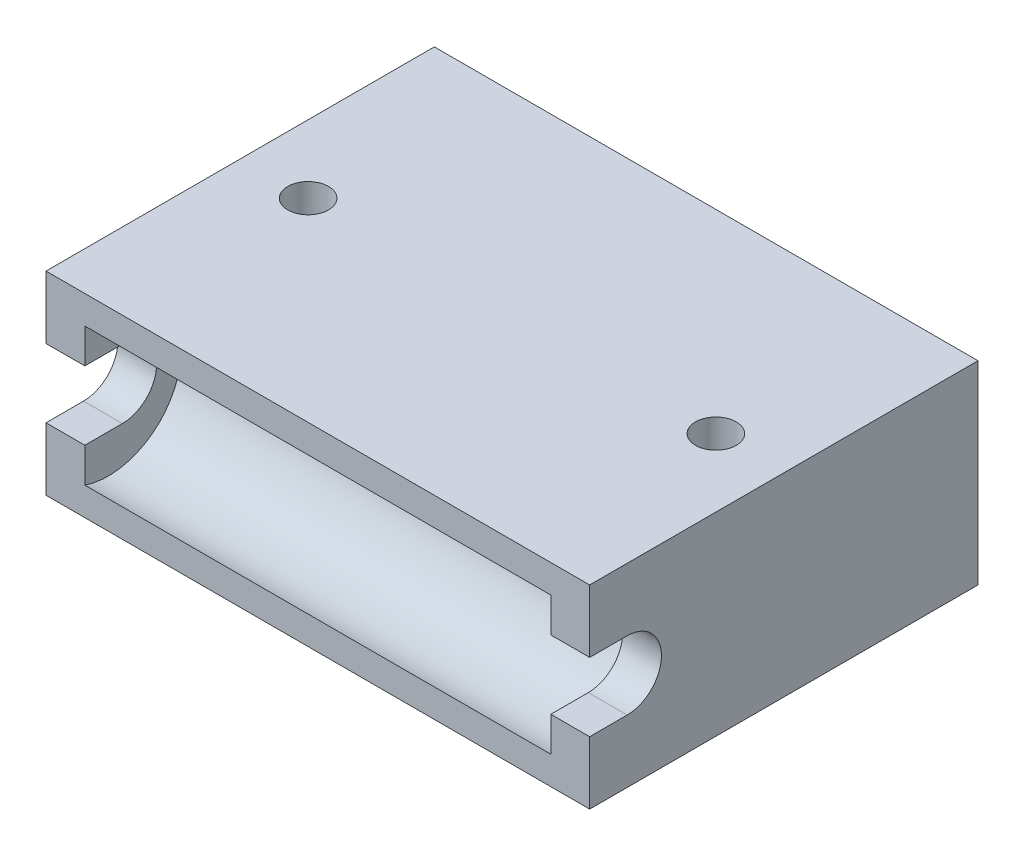
ISO-10303-21;
HEADER;
FILE_DESCRIPTION(('STEP AP214'),'2;1');
FILE_NAME('part.step','',(''),(''),'','','');
FILE_SCHEMA(('AUTOMOTIVE_DESIGN { 1 0 10303 214 1 1 1 1 }'));
ENDSEC;
DATA;
#1=APPLICATION_CONTEXT('core data for automotive mechanical design processes');
#2=APPLICATION_PROTOCOL_DEFINITION('international standard','automotive_design',2000,#1);
#3=PRODUCT_CONTEXT('',#1,'mechanical');
#4=PRODUCT('Part','Part','',(#3));
#5=PRODUCT_RELATED_PRODUCT_CATEGORY('part','',(#4));
#6=PRODUCT_DEFINITION_FORMATION('','',#4);
#7=PRODUCT_DEFINITION_CONTEXT('part definition',#1,'design');
#8=PRODUCT_DEFINITION('design','',#6,#7);
#9=PRODUCT_DEFINITION_SHAPE('','',#8);
#10=(LENGTH_UNIT() NAMED_UNIT(*) SI_UNIT(.MILLI.,.METRE.));
#11=(NAMED_UNIT(*) PLANE_ANGLE_UNIT() SI_UNIT($,.RADIAN.));
#12=(NAMED_UNIT(*) SI_UNIT($,.STERADIAN.) SOLID_ANGLE_UNIT());
#13=UNCERTAINTY_MEASURE_WITH_UNIT(LENGTH_MEASURE(1.E-05),#10,'distance_accuracy_value','');
#14=(GEOMETRIC_REPRESENTATION_CONTEXT(3) GLOBAL_UNCERTAINTY_ASSIGNED_CONTEXT((#13)) GLOBAL_UNIT_ASSIGNED_CONTEXT((#10,
#11,#12)) REPRESENTATION_CONTEXT('',''));
#15=CARTESIAN_POINT('',(0.,0.,0.));
#16=DIRECTION('',(0.,0.,1.));
#17=DIRECTION('',(1.,0.,0.));
#18=AXIS2_PLACEMENT_3D('',#15,#16,#17);
#19=CARTESIAN_POINT('',(16.7824266476569,0.,21.5533474487606));
#20=DIRECTION('',(0.,1.,0.));
#21=DIRECTION('',(0.,0.,1.));
#22=AXIS2_PLACEMENT_3D('',#19,#20,#21);
#23=CYLINDRICAL_SURFACE('',#22,2.1);
#24=CARTESIAN_POINT('',(16.7824266476569,20.,21.5533474487606));
#25=DIRECTION('',(0.,1.,0.));
#26=DIRECTION('',(0.,0.,1.));
#27=AXIS2_PLACEMENT_3D('',#24,#25,#26);
#28=CIRCLE('',#27,2.1);
#29=CARTESIAN_POINT('',(16.7824266476569,20.,23.6533474487606));
#30=VERTEX_POINT('',#29);
#31=EDGE_CURVE('E311',#30,#30,#28,.T.);
#32=ORIENTED_EDGE('',*,*,#31,.T.);
#33=EDGE_LOOP('',(#32));
#34=FACE_BOUND('',#33,.T.);
#35=CARTESIAN_POINT('',(16.7824266476569,10.,21.5533474487606));
#36=DIRECTION('',(0.,-1.,0.));
#37=DIRECTION('',(0.,0.,-1.));
#38=AXIS2_PLACEMENT_3D('',#35,#36,#37);
#39=CIRCLE('',#38,2.1);
#40=CARTESIAN_POINT('',(16.7824266476569,10.,19.4533474487606));
#41=VERTEX_POINT('',#40);
#42=EDGE_CURVE('E39',#41,#41,#39,.F.);
#43=ORIENTED_EDGE('',*,*,#42,.F.);
#44=EDGE_LOOP('',(#43));
#45=FACE_BOUND('',#44,.T.);
#46=ADVANCED_FACE('F35',(#34,#45),#23,.F.);
#47=CARTESIAN_POINT('',(-25.2175733523431,0.,21.5533474487606));
#48=DIRECTION('',(0.,1.,0.));
#49=DIRECTION('',(0.,0.,1.));
#50=AXIS2_PLACEMENT_3D('',#47,#48,#49);
#51=CYLINDRICAL_SURFACE('',#50,2.1);
#52=CARTESIAN_POINT('',(-25.2175733523431,20.,21.5533474487606));
#53=DIRECTION('',(0.,1.,0.));
#54=DIRECTION('',(0.,0.,1.));
#55=AXIS2_PLACEMENT_3D('',#52,#53,#54);
#56=CIRCLE('',#55,2.1);
#57=CARTESIAN_POINT('',(-25.2175733523431,20.,23.6533474487606));
#58=VERTEX_POINT('',#57);
#59=EDGE_CURVE('E314',#58,#58,#56,.T.);
#60=ORIENTED_EDGE('',*,*,#59,.T.);
#61=EDGE_LOOP('',(#60));
#62=FACE_BOUND('',#61,.T.);
#63=CARTESIAN_POINT('',(-25.2175733523431,10.,21.5533474487606));
#64=DIRECTION('',(0.,-1.,0.));
#65=DIRECTION('',(0.,0.,-1.));
#66=AXIS2_PLACEMENT_3D('',#63,#64,#65);
#67=CIRCLE('',#66,2.1);
#68=CARTESIAN_POINT('',(-25.2175733523431,10.,19.4533474487606));
#69=VERTEX_POINT('',#68);
#70=EDGE_CURVE('E301',#69,#69,#67,.F.);
#71=ORIENTED_EDGE('',*,*,#70,.F.);
#72=EDGE_LOOP('',(#71));
#73=FACE_BOUND('',#72,.T.);
#74=ADVANCED_FACE('F429',(#62,#73),#51,.F.);
#75=CARTESIAN_POINT('',(-32.2175733523431,20.,41.5533474487606));
#76=DIRECTION('',(0.,0.,-1.));
#77=DIRECTION('',(-1.,0.,0.));
#78=AXIS2_PLACEMENT_3D('',#75,#76,#77);
#79=PLANE('',#78);
#80=DIRECTION('',(1.,0.,0.));
#81=VECTOR('',#80,1.);
#82=CARTESIAN_POINT('',(-32.2175733523431,6.465,41.5533474487606));
#83=LINE('',#82,#81);
#84=CARTESIAN_POINT('',(-32.2175733523431,6.465,41.5533474487606));
#85=VERTEX_POINT('',#84);
#86=CARTESIAN_POINT('',(-28.2175733523431,6.465,41.5533474487606));
#87=VERTEX_POINT('',#86);
#88=EDGE_CURVE('E343',#85,#87,#83,.T.);
#89=ORIENTED_EDGE('',*,*,#88,.F.);
#90=DIRECTION('',(0.,-1.,0.));
#91=VECTOR('',#90,1.);
#92=CARTESIAN_POINT('',(-32.2175733523431,20.,41.5533474487606));
#93=LINE('',#92,#91);
#94=CARTESIAN_POINT('',(-32.2175733523431,0.,41.5533474487606));
#95=VERTEX_POINT('',#94);
#96=EDGE_CURVE('E402',#85,#95,#93,.T.);
#97=ORIENTED_EDGE('',*,*,#96,.T.);
#98=DIRECTION('',(1.,0.,0.));
#99=VECTOR('',#98,1.);
#100=CARTESIAN_POINT('',(-32.2175733523431,0.,41.5533474487606));
#101=LINE('',#100,#99);
#102=CARTESIAN_POINT('',(23.7824266476569,0.,41.5533474487606));
#103=VERTEX_POINT('',#102);
#104=EDGE_CURVE('E391',#95,#103,#101,.T.);
#105=ORIENTED_EDGE('',*,*,#104,.T.);
#106=DIRECTION('',(0.,-1.,0.));
#107=VECTOR('',#106,1.);
#108=CARTESIAN_POINT('',(23.7824266476569,20.,41.5533474487606));
#109=LINE('',#108,#107);
#110=CARTESIAN_POINT('',(23.7824266476569,6.465,41.5533474487606));
#111=VERTEX_POINT('',#110);
#112=EDGE_CURVE('E406',#111,#103,#109,.T.);
#113=ORIENTED_EDGE('',*,*,#112,.F.);
#114=CARTESIAN_POINT('',(19.7824266476569,6.465,41.5533474487606));
#115=VERTEX_POINT('',#114);
#116=EDGE_CURVE('E342',#115,#111,#83,.T.);
#117=ORIENTED_EDGE('',*,*,#116,.F.);
#118=DIRECTION('',(0.,1.,0.));
#119=VECTOR('',#118,1.);
#120=CARTESIAN_POINT('',(19.7824266476569,20.,41.5533474487606));
#121=LINE('',#120,#119);
#122=CARTESIAN_POINT('',(19.7824266476569,2.90034244287919,41.5533474487606));
#123=VERTEX_POINT('',#122);
#124=EDGE_CURVE('E418',#123,#115,#121,.T.);
#125=ORIENTED_EDGE('',*,*,#124,.F.);
#126=DIRECTION('',(-1.,0.,0.));
#127=VECTOR('',#126,1.);
#128=CARTESIAN_POINT('',(19.7824266476569,2.90034244287919,41.5533474487606));
#129=LINE('',#128,#127);
#130=CARTESIAN_POINT('',(-28.2175733523431,2.90034244287919,41.5533474487606));
#131=VERTEX_POINT('',#130);
#132=EDGE_CURVE('E414',#123,#131,#129,.T.);
#133=ORIENTED_EDGE('',*,*,#132,.T.);
#134=DIRECTION('',(0.,1.,0.));
#135=VECTOR('',#134,1.);
#136=CARTESIAN_POINT('',(-28.2175733523431,20.,41.5533474487606));
#137=LINE('',#136,#135);
#138=EDGE_CURVE('E408',#131,#87,#137,.T.);
#139=ORIENTED_EDGE('',*,*,#138,.T.);
#140=EDGE_LOOP('',(#89,#97,#105,#113,#117,#125,#133,#139));
#141=FACE_BOUND('',#140,.T.);
#142=ADVANCED_FACE('F431',(#141),#79,.F.);
#143=DIRECTION('',(1.,0.,0.));
#144=VECTOR('',#143,1.);
#145=CARTESIAN_POINT('',(-32.2175733523431,13.535,41.5533474487606));
#146=LINE('',#145,#144);
#147=CARTESIAN_POINT('',(19.7824266476569,13.535,41.5533474487606));
#148=VERTEX_POINT('',#147);
#149=CARTESIAN_POINT('',(23.7824266476569,13.535,41.5533474487606));
#150=VERTEX_POINT('',#149);
#151=EDGE_CURVE('E338',#148,#150,#146,.T.);
#152=ORIENTED_EDGE('',*,*,#151,.T.);
#153=CARTESIAN_POINT('',(23.7824266476569,20.,41.5533474487606));
#154=VERTEX_POINT('',#153);
#155=EDGE_CURVE('E403',#154,#150,#109,.T.);
#156=ORIENTED_EDGE('',*,*,#155,.F.);
#157=DIRECTION('',(1.,0.,0.));
#158=VECTOR('',#157,1.);
#159=CARTESIAN_POINT('',(-32.2175733523431,20.,41.5533474487606));
#160=LINE('',#159,#158);
#161=CARTESIAN_POINT('',(-32.2175733523431,20.,41.5533474487606));
#162=VERTEX_POINT('',#161);
#163=EDGE_CURVE('E381',#162,#154,#160,.T.);
#164=ORIENTED_EDGE('',*,*,#163,.F.);
#165=CARTESIAN_POINT('',(-32.2175733523431,13.535,41.5533474487606));
#166=VERTEX_POINT('',#165);
#167=EDGE_CURVE('E399',#162,#166,#93,.T.);
#168=ORIENTED_EDGE('',*,*,#167,.T.);
#169=CARTESIAN_POINT('',(-28.2175733523431,13.535,41.5533474487606));
#170=VERTEX_POINT('',#169);
#171=EDGE_CURVE('E339',#166,#170,#146,.T.);
#172=ORIENTED_EDGE('',*,*,#171,.T.);
#173=CARTESIAN_POINT('',(-28.2175733523431,17.0996575571208,41.5533474487606));
#174=VERTEX_POINT('',#173);
#175=EDGE_CURVE('E398',#170,#174,#137,.T.);
#176=ORIENTED_EDGE('',*,*,#175,.T.);
#177=DIRECTION('',(-1.,0.,0.));
#178=VECTOR('',#177,1.);
#179=CARTESIAN_POINT('',(19.7824266476569,17.0996575571208,41.5533474487606));
#180=LINE('',#179,#178);
#181=CARTESIAN_POINT('',(19.7824266476569,17.0996575571208,41.5533474487606));
#182=VERTEX_POINT('',#181);
#183=EDGE_CURVE('E411',#174,#182,#180,.F.);
#184=ORIENTED_EDGE('',*,*,#183,.T.);
#185=EDGE_CURVE('E417',#148,#182,#121,.T.);
#186=ORIENTED_EDGE('',*,*,#185,.F.);
#187=EDGE_LOOP('',(#152,#156,#164,#168,#172,#176,#184,#186));
#188=FACE_BOUND('',#187,.T.);
#189=ADVANCED_FACE('F439',(#188),#79,.F.);
#190=CARTESIAN_POINT('',(-32.2175733523431,20.,1.55334744876063));
#191=DIRECTION('',(1.,0.,0.));
#192=DIRECTION('',(0.,0.,-1.));
#193=AXIS2_PLACEMENT_3D('',#190,#191,#192);
#194=PLANE('',#193);
#195=DIRECTION('',(0.,0.,1.));
#196=VECTOR('',#195,1.);
#197=CARTESIAN_POINT('',(-32.2175733523431,6.465,37.6937344646251));
#198=LINE('',#197,#196);
#199=CARTESIAN_POINT('',(-32.2175733523431,6.465,37.6937344646251));
#200=VERTEX_POINT('',#199);
#201=EDGE_CURVE('E331',#200,#85,#198,.T.);
#202=ORIENTED_EDGE('',*,*,#201,.F.);
#203=CARTESIAN_POINT('',(-32.2175733523431,10.,37.6937344646251));
#204=DIRECTION('',(-1.,0.,0.));
#205=DIRECTION('',(0.,0.,1.));
#206=AXIS2_PLACEMENT_3D('',#203,#204,#205);
#207=CIRCLE('',#206,3.53499999999999);
#208=CARTESIAN_POINT('',(-32.2175733523431,13.535,37.6937344646251));
#209=VERTEX_POINT('',#208);
#210=EDGE_CURVE('E327',#209,#200,#207,.T.);
#211=ORIENTED_EDGE('',*,*,#210,.F.);
#212=DIRECTION('',(0.,0.,-1.));
#213=VECTOR('',#212,1.);
#214=CARTESIAN_POINT('',(-32.2175733523431,13.535,37.6937344646251));
#215=LINE('',#214,#213);
#216=EDGE_CURVE('E333',#166,#209,#215,.T.);
#217=ORIENTED_EDGE('',*,*,#216,.F.);
#218=ORIENTED_EDGE('',*,*,#167,.F.);
#219=DIRECTION('',(0.,0.,1.));
#220=VECTOR('',#219,1.);
#221=CARTESIAN_POINT('',(-32.2175733523431,20.,1.55334744876063));
#222=LINE('',#221,#220);
#223=CARTESIAN_POINT('',(-32.2175733523431,20.,1.55334744876063));
#224=VERTEX_POINT('',#223);
#225=EDGE_CURVE('E383',#224,#162,#222,.T.);
#226=ORIENTED_EDGE('',*,*,#225,.F.);
#227=DIRECTION('',(0.,-1.,0.));
#228=VECTOR('',#227,1.);
#229=CARTESIAN_POINT('',(-32.2175733523431,20.,1.55334744876063));
#230=LINE('',#229,#228);
#231=CARTESIAN_POINT('',(-32.2175733523431,0.,1.55334744876063));
#232=VERTEX_POINT('',#231);
#233=EDGE_CURVE('E396',#224,#232,#230,.T.);
#234=ORIENTED_EDGE('',*,*,#233,.T.);
#235=DIRECTION('',(0.,0.,1.));
#236=VECTOR('',#235,1.);
#237=CARTESIAN_POINT('',(-32.2175733523431,0.,1.55334744876063));
#238=LINE('',#237,#236);
#239=EDGE_CURVE('E378',#232,#95,#238,.T.);
#240=ORIENTED_EDGE('',*,*,#239,.T.);
#241=ORIENTED_EDGE('',*,*,#96,.F.);
#242=EDGE_LOOP('',(#202,#211,#217,#218,#226,#234,#240,#241));
#243=FACE_BOUND('',#242,.T.);
#244=ADVANCED_FACE('F497',(#243),#194,.F.);
#245=CARTESIAN_POINT('',(23.7824266476569,20.,1.55334744876063));
#246=DIRECTION('',(1.,0.,0.));
#247=DIRECTION('',(0.,0.,-1.));
#248=AXIS2_PLACEMENT_3D('',#245,#246,#247);
#249=PLANE('',#248);
#250=CARTESIAN_POINT('',(23.7824266476569,10.,37.6937344646251));
#251=DIRECTION('',(1.,0.,0.));
#252=DIRECTION('',(0.,0.,-1.));
#253=AXIS2_PLACEMENT_3D('',#250,#251,#252);
#254=CIRCLE('',#253,3.53499999999999);
#255=CARTESIAN_POINT('',(23.7824266476569,13.535,37.6937344646251));
#256=VERTEX_POINT('',#255);
#257=CARTESIAN_POINT('',(23.7824266476569,6.465,37.6937344646251));
#258=VERTEX_POINT('',#257);
#259=EDGE_CURVE('E364',#256,#258,#254,.F.);
#260=ORIENTED_EDGE('',*,*,#259,.T.);
#261=DIRECTION('',(0.,0.,1.));
#262=VECTOR('',#261,1.);
#263=CARTESIAN_POINT('',(23.7824266476569,6.465,1.55334744876063));
#264=LINE('',#263,#262);
#265=EDGE_CURVE('E358',#258,#111,#264,.T.);
#266=ORIENTED_EDGE('',*,*,#265,.T.);
#267=ORIENTED_EDGE('',*,*,#112,.T.);
#268=DIRECTION('',(0.,0.,1.));
#269=VECTOR('',#268,1.);
#270=CARTESIAN_POINT('',(23.7824266476569,0.,1.55334744876063));
#271=LINE('',#270,#269);
#272=CARTESIAN_POINT('',(23.7824266476569,0.,1.55334744876063));
#273=VERTEX_POINT('',#272);
#274=EDGE_CURVE('E388',#273,#103,#271,.T.);
#275=ORIENTED_EDGE('',*,*,#274,.F.);
#276=DIRECTION('',(0.,-1.,0.));
#277=VECTOR('',#276,1.);
#278=CARTESIAN_POINT('',(23.7824266476569,20.,1.55334744876063));
#279=LINE('',#278,#277);
#280=CARTESIAN_POINT('',(23.7824266476569,20.,1.55334744876063));
#281=VERTEX_POINT('',#280);
#282=EDGE_CURVE('E385',#281,#273,#279,.T.);
#283=ORIENTED_EDGE('',*,*,#282,.F.);
#284=DIRECTION('',(0.,0.,1.));
#285=VECTOR('',#284,1.);
#286=CARTESIAN_POINT('',(23.7824266476569,20.,1.55334744876063));
#287=LINE('',#286,#285);
#288=EDGE_CURVE('E377',#281,#154,#287,.T.);
#289=ORIENTED_EDGE('',*,*,#288,.T.);
#290=ORIENTED_EDGE('',*,*,#155,.T.);
#291=DIRECTION('',(0.,0.,-1.));
#292=VECTOR('',#291,1.);
#293=CARTESIAN_POINT('',(23.7824266476569,13.535,1.55334744876063));
#294=LINE('',#293,#292);
#295=EDGE_CURVE('E352',#150,#256,#294,.T.);
#296=ORIENTED_EDGE('',*,*,#295,.T.);
#297=EDGE_LOOP('',(#260,#266,#267,#275,#283,#289,#290,#296));
#298=FACE_BOUND('',#297,.T.);
#299=ADVANCED_FACE('F480',(#298),#249,.T.);
#300=CARTESIAN_POINT('',(19.7824266476569,10.,39.1357323901507));
#301=DIRECTION('',(-1.,0.,0.));
#302=DIRECTION('',(0.,0.,1.));
#303=AXIS2_PLACEMENT_3D('',#300,#301,#302);
#304=PLANE('',#303);
#305=ORIENTED_EDGE('',*,*,#124,.T.);
#306=DIRECTION('',(0.,0.,-1.));
#307=VECTOR('',#306,1.);
#308=CARTESIAN_POINT('',(19.7824266476569,6.465,39.1357323901507));
#309=LINE('',#308,#307);
#310=CARTESIAN_POINT('',(19.7824266476569,6.465,37.6937344646251));
#311=VERTEX_POINT('',#310);
#312=EDGE_CURVE('E355',#115,#311,#309,.T.);
#313=ORIENTED_EDGE('',*,*,#312,.T.);
#314=CARTESIAN_POINT('',(19.7824266476569,10.,37.6937344646251));
#315=DIRECTION('',(-1.,0.,0.));
#316=DIRECTION('',(0.,0.,1.));
#317=AXIS2_PLACEMENT_3D('',#314,#315,#316);
#318=CIRCLE('',#317,3.53499999999999);
#319=CARTESIAN_POINT('',(19.7824266476569,13.535,37.6937344646251));
#320=VERTEX_POINT('',#319);
#321=EDGE_CURVE('E361',#311,#320,#318,.F.);
#322=ORIENTED_EDGE('',*,*,#321,.T.);
#323=DIRECTION('',(0.,0.,1.));
#324=VECTOR('',#323,1.);
#325=CARTESIAN_POINT('',(19.7824266476569,13.535,39.1357323901507));
#326=LINE('',#325,#324);
#327=EDGE_CURVE('E349',#320,#148,#326,.T.);
#328=ORIENTED_EDGE('',*,*,#327,.T.);
#329=ORIENTED_EDGE('',*,*,#185,.T.);
#330=CARTESIAN_POINT('',(19.7824266476569,10.,39.1357323901507));
#331=DIRECTION('',(-1.,0.,0.));
#332=DIRECTION('',(0.,0.,1.));
#333=AXIS2_PLACEMENT_3D('',#330,#331,#332);
#334=CIRCLE('',#333,7.5);
#335=EDGE_CURVE('E368',#182,#123,#334,.T.);
#336=ORIENTED_EDGE('',*,*,#335,.T.);
#337=EDGE_LOOP('',(#305,#313,#322,#328,#329,#336));
#338=FACE_BOUND('',#337,.T.);
#339=ADVANCED_FACE('F476',(#338),#304,.T.);
#340=CARTESIAN_POINT('',(-28.2175733523431,10.,39.1357323901507));
#341=DIRECTION('',(-1.,0.,0.));
#342=DIRECTION('',(0.,0.,1.));
#343=AXIS2_PLACEMENT_3D('',#340,#341,#342);
#344=PLANE('',#343);
#345=DIRECTION('',(0.,0.,-1.));
#346=VECTOR('',#345,1.);
#347=CARTESIAN_POINT('',(-28.2175733523431,6.465,39.1357323901507));
#348=LINE('',#347,#346);
#349=CARTESIAN_POINT('',(-28.2175733523431,6.465,37.6937344646251));
#350=VERTEX_POINT('',#349);
#351=EDGE_CURVE('E11',#87,#350,#348,.T.);
#352=ORIENTED_EDGE('',*,*,#351,.F.);
#353=ORIENTED_EDGE('',*,*,#138,.F.);
#354=CARTESIAN_POINT('',(-28.2175733523431,10.,39.1357323901507));
#355=DIRECTION('',(-1.,0.,0.));
#356=DIRECTION('',(0.,0.,1.));
#357=AXIS2_PLACEMENT_3D('',#354,#355,#356);
#358=CIRCLE('',#357,7.5);
#359=EDGE_CURVE('E367',#174,#131,#358,.T.);
#360=ORIENTED_EDGE('',*,*,#359,.F.);
#361=ORIENTED_EDGE('',*,*,#175,.F.);
#362=DIRECTION('',(0.,0.,1.));
#363=VECTOR('',#362,1.);
#364=CARTESIAN_POINT('',(-28.2175733523431,13.535,39.1357323901507));
#365=LINE('',#364,#363);
#366=CARTESIAN_POINT('',(-28.2175733523431,13.535,37.6937344646251));
#367=VERTEX_POINT('',#366);
#368=EDGE_CURVE('E421',#367,#170,#365,.T.);
#369=ORIENTED_EDGE('',*,*,#368,.F.);
#370=CARTESIAN_POINT('',(-28.2175733523431,10.,37.6937344646251));
#371=DIRECTION('',(-1.,0.,0.));
#372=DIRECTION('',(0.,0.,1.));
#373=AXIS2_PLACEMENT_3D('',#370,#371,#372);
#374=CIRCLE('',#373,3.53499999999999);
#375=EDGE_CURVE('E44',#350,#367,#374,.F.);
#376=ORIENTED_EDGE('',*,*,#375,.F.);
#377=EDGE_LOOP('',(#352,#353,#360,#361,#369,#376));
#378=FACE_BOUND('',#377,.T.);
#379=ADVANCED_FACE('F479',(#378),#344,.F.);
#380=CARTESIAN_POINT('',(-32.2175733523431,20.,1.55334744876063));
#381=DIRECTION('',(0.,0.,-1.));
#382=DIRECTION('',(-1.,0.,0.));
#383=AXIS2_PLACEMENT_3D('',#380,#381,#382);
#384=PLANE('',#383);
#385=CARTESIAN_POINT('',(-25.2175733523431,10.,1.55334744876063));
#386=DIRECTION('',(0.,0.,-1.));
#387=DIRECTION('',(-1.,0.,0.));
#388=AXIS2_PLACEMENT_3D('',#385,#386,#387);
#389=CIRCLE('',#388,4.15);
#390=CARTESIAN_POINT('',(-29.3675733523431,10.,1.55334744876063));
#391=VERTEX_POINT('',#390);
#392=EDGE_CURVE('E317',#391,#391,#389,.T.);
#393=ORIENTED_EDGE('',*,*,#392,.F.);
#394=EDGE_LOOP('',(#393));
#395=FACE_BOUND('',#394,.T.);
#396=CARTESIAN_POINT('',(16.7824266476569,10.,1.55334744876063));
#397=DIRECTION('',(0.,0.,-1.));
#398=DIRECTION('',(-1.,0.,0.));
#399=AXIS2_PLACEMENT_3D('',#396,#397,#398);
#400=CIRCLE('',#399,4.15);
#401=CARTESIAN_POINT('',(12.6324266476569,10.,1.55334744876063));
#402=VERTEX_POINT('',#401);
#403=EDGE_CURVE('E321',#402,#402,#400,.T.);
#404=ORIENTED_EDGE('',*,*,#403,.F.);
#405=EDGE_LOOP('',(#404));
#406=FACE_BOUND('',#405,.T.);
#407=DIRECTION('',(1.,0.,0.));
#408=VECTOR('',#407,1.);
#409=CARTESIAN_POINT('',(-32.2175733523431,0.,1.55334744876063));
#410=LINE('',#409,#408);
#411=EDGE_CURVE('E371',#232,#273,#410,.T.);
#412=ORIENTED_EDGE('',*,*,#411,.F.);
#413=ORIENTED_EDGE('',*,*,#233,.F.);
#414=DIRECTION('',(1.,0.,0.));
#415=VECTOR('',#414,1.);
#416=CARTESIAN_POINT('',(-32.2175733523431,20.,1.55334744876063));
#417=LINE('',#416,#415);
#418=EDGE_CURVE('E374',#224,#281,#417,.T.);
#419=ORIENTED_EDGE('',*,*,#418,.T.);
#420=ORIENTED_EDGE('',*,*,#282,.T.);
#421=EDGE_LOOP('',(#412,#413,#419,#420));
#422=FACE_BOUND('',#421,.T.);
#423=ADVANCED_FACE('F37',(#395,#406,#422),#384,.T.);
#424=CARTESIAN_POINT('',(0.,20.,0.));
#425=DIRECTION('',(0.,-1.,0.));
#426=DIRECTION('',(0.,0.,-1.));
#427=AXIS2_PLACEMENT_3D('',#424,#425,#426);
#428=PLANE('',#427);
#429=ORIENTED_EDGE('',*,*,#31,.F.);
#430=EDGE_LOOP('',(#429));
#431=FACE_BOUND('',#430,.T.);
#432=ORIENTED_EDGE('',*,*,#59,.F.);
#433=EDGE_LOOP('',(#432));
#434=FACE_BOUND('',#433,.T.);
#435=ORIENTED_EDGE('',*,*,#418,.F.);
#436=ORIENTED_EDGE('',*,*,#225,.T.);
#437=ORIENTED_EDGE('',*,*,#163,.T.);
#438=ORIENTED_EDGE('',*,*,#288,.F.);
#439=EDGE_LOOP('',(#435,#436,#437,#438));
#440=FACE_BOUND('',#439,.T.);
#441=ADVANCED_FACE('F490',(#431,#434,#440),#428,.F.);
#442=CARTESIAN_POINT('',(0.,0.,0.));
#443=DIRECTION('',(0.,-1.,0.));
#444=DIRECTION('',(0.,0.,-1.));
#445=AXIS2_PLACEMENT_3D('',#442,#443,#444);
#446=PLANE('',#445);
#447=DIRECTION('',(0.5,0.,0.866025403784438));
#448=VECTOR('',#447,1.);
#449=CARTESIAN_POINT('',(18.8031525898206,0.,18.0533474487606));
#450=LINE('',#449,#448);
#451=CARTESIAN_POINT('',(18.8031525898206,0.,18.0533474487606));
#452=VERTEX_POINT('',#451);
#453=CARTESIAN_POINT('',(20.8238785319843,0.,21.5533474487606));
#454=VERTEX_POINT('',#453);
#455=EDGE_CURVE('E52',#452,#454,#450,.T.);
#456=ORIENTED_EDGE('',*,*,#455,.F.);
#457=DIRECTION('',(1.,0.,0.));
#458=VECTOR('',#457,1.);
#459=CARTESIAN_POINT('',(14.7617007054932,0.,18.0533474487606));
#460=LINE('',#459,#458);
#461=CARTESIAN_POINT('',(14.7617007054932,0.,18.0533474487606));
#462=VERTEX_POINT('',#461);
#463=EDGE_CURVE('E231',#462,#452,#460,.T.);
#464=ORIENTED_EDGE('',*,*,#463,.F.);
#465=DIRECTION('',(0.5,0.,-0.866025403784439));
#466=VECTOR('',#465,1.);
#467=CARTESIAN_POINT('',(12.7409747633296,0.,21.5533474487606));
#468=LINE('',#467,#466);
#469=CARTESIAN_POINT('',(12.7409747633296,0.,21.5533474487606));
#470=VERTEX_POINT('',#469);
#471=EDGE_CURVE('E234',#470,#462,#468,.T.);
#472=ORIENTED_EDGE('',*,*,#471,.F.);
#473=DIRECTION('',(-0.5,0.,-0.866025403784439));
#474=VECTOR('',#473,1.);
#475=CARTESIAN_POINT('',(14.7617007054932,0.,25.0533474487606));
#476=LINE('',#475,#474);
#477=CARTESIAN_POINT('',(14.7617007054932,0.,25.0533474487606));
#478=VERTEX_POINT('',#477);
#479=EDGE_CURVE('E250',#478,#470,#476,.T.);
#480=ORIENTED_EDGE('',*,*,#479,.F.);
#481=DIRECTION('',(-1.,0.,0.));
#482=VECTOR('',#481,1.);
#483=CARTESIAN_POINT('',(18.8031525898206,0.,25.0533474487606));
#484=LINE('',#483,#482);
#485=CARTESIAN_POINT('',(18.8031525898206,0.,25.0533474487606));
#486=VERTEX_POINT('',#485);
#487=EDGE_CURVE('E247',#486,#478,#484,.T.);
#488=ORIENTED_EDGE('',*,*,#487,.F.);
#489=DIRECTION('',(-0.5,0.,0.866025403784439));
#490=VECTOR('',#489,1.);
#491=CARTESIAN_POINT('',(20.8238785319843,0.,21.5533474487606));
#492=LINE('',#491,#490);
#493=EDGE_CURVE('E245',#454,#486,#492,.T.);
#494=ORIENTED_EDGE('',*,*,#493,.F.);
#495=EDGE_LOOP('',(#456,#464,#472,#480,#488,#494));
#496=FACE_BOUND('',#495,.T.);
#497=DIRECTION('',(0.499999999999999,0.,0.866025403784439));
#498=VECTOR('',#497,1.);
#499=CARTESIAN_POINT('',(-23.1968474101794,0.,18.0533474487606));
#500=LINE('',#499,#498);
#501=CARTESIAN_POINT('',(-23.1968474101794,0.,18.0533474487606));
#502=VERTEX_POINT('',#501);
#503=CARTESIAN_POINT('',(-21.1761214680157,0.,21.5533474487606));
#504=VERTEX_POINT('',#503);
#505=EDGE_CURVE('E60',#502,#504,#500,.T.);
#506=ORIENTED_EDGE('',*,*,#505,.F.);
#507=DIRECTION('',(1.,0.,0.));
#508=VECTOR('',#507,1.);
#509=CARTESIAN_POINT('',(-27.2382992945068,0.,18.0533474487606));
#510=LINE('',#509,#508);
#511=CARTESIAN_POINT('',(-27.2382992945068,0.,18.0533474487606));
#512=VERTEX_POINT('',#511);
#513=EDGE_CURVE('E268',#512,#502,#510,.T.);
#514=ORIENTED_EDGE('',*,*,#513,.F.);
#515=DIRECTION('',(0.5,0.,-0.866025403784439));
#516=VECTOR('',#515,1.);
#517=CARTESIAN_POINT('',(-29.2590252366704,0.,21.5533474487606));
#518=LINE('',#517,#516);
#519=CARTESIAN_POINT('',(-29.2590252366704,0.,21.5533474487606));
#520=VERTEX_POINT('',#519);
#521=EDGE_CURVE('E294',#520,#512,#518,.T.);
#522=ORIENTED_EDGE('',*,*,#521,.F.);
#523=DIRECTION('',(-0.5,0.,-0.866025403784439));
#524=VECTOR('',#523,1.);
#525=CARTESIAN_POINT('',(-27.2382992945068,0.,25.0533474487606));
#526=LINE('',#525,#524);
#527=CARTESIAN_POINT('',(-27.2382992945068,0.,25.0533474487606));
#528=VERTEX_POINT('',#527);
#529=EDGE_CURVE('E291',#528,#520,#526,.T.);
#530=ORIENTED_EDGE('',*,*,#529,.F.);
#531=DIRECTION('',(-1.,0.,0.));
#532=VECTOR('',#531,1.);
#533=CARTESIAN_POINT('',(-23.1968474101794,0.,25.0533474487606));
#534=LINE('',#533,#532);
#535=CARTESIAN_POINT('',(-23.1968474101794,0.,25.0533474487606));
#536=VERTEX_POINT('',#535);
#537=EDGE_CURVE('E288',#536,#528,#534,.T.);
#538=ORIENTED_EDGE('',*,*,#537,.F.);
#539=DIRECTION('',(-0.5,0.,0.866025403784439));
#540=VECTOR('',#539,1.);
#541=CARTESIAN_POINT('',(-21.1761214680157,0.,21.5533474487606));
#542=LINE('',#541,#540);
#543=EDGE_CURVE('E285',#504,#536,#542,.T.);
#544=ORIENTED_EDGE('',*,*,#543,.F.);
#545=EDGE_LOOP('',(#506,#514,#522,#530,#538,#544));
#546=FACE_BOUND('',#545,.T.);
#547=ORIENTED_EDGE('',*,*,#411,.T.);
#548=ORIENTED_EDGE('',*,*,#274,.T.);
#549=ORIENTED_EDGE('',*,*,#104,.F.);
#550=ORIENTED_EDGE('',*,*,#239,.F.);
#551=EDGE_LOOP('',(#547,#548,#549,#550));
#552=FACE_BOUND('',#551,.T.);
#553=ADVANCED_FACE('F488',(#496,#546,#552),#446,.T.);
#554=CARTESIAN_POINT('',(19.7824266476569,10.,39.1357323901507));
#555=DIRECTION('',(-1.,0.,0.));
#556=DIRECTION('',(0.,0.,1.));
#557=AXIS2_PLACEMENT_3D('',#554,#555,#556);
#558=CYLINDRICAL_SURFACE('',#557,7.5);
#559=ORIENTED_EDGE('',*,*,#335,.F.);
#560=ORIENTED_EDGE('',*,*,#183,.F.);
#561=ORIENTED_EDGE('',*,*,#359,.T.);
#562=ORIENTED_EDGE('',*,*,#132,.F.);
#563=EDGE_LOOP('',(#559,#560,#561,#562));
#564=FACE_BOUND('',#563,.T.);
#565=ADVANCED_FACE('F485',(#564),#558,.F.);
#566=CARTESIAN_POINT('',(-32.2175733523431,13.535,37.6937344646251));
#567=DIRECTION('',(0.,-1.,0.));
#568=DIRECTION('',(0.,0.,-1.));
#569=AXIS2_PLACEMENT_3D('',#566,#567,#568);
#570=PLANE('',#569);
#571=ORIENTED_EDGE('',*,*,#368,.T.);
#572=ORIENTED_EDGE('',*,*,#171,.F.);
#573=ORIENTED_EDGE('',*,*,#216,.T.);
#574=DIRECTION('',(1.,0.,0.));
#575=VECTOR('',#574,1.);
#576=CARTESIAN_POINT('',(-32.2175733523431,13.535,37.6937344646251));
#577=LINE('',#576,#575);
#578=EDGE_CURVE('E336',#209,#367,#577,.T.);
#579=ORIENTED_EDGE('',*,*,#578,.T.);
#580=EDGE_LOOP('',(#571,#572,#573,#579));
#581=FACE_BOUND('',#580,.T.);
#582=ADVANCED_FACE('F466',(#581),#570,.T.);
#583=CARTESIAN_POINT('',(-32.2175733523431,6.465,37.6937344646251));
#584=DIRECTION('',(0.,1.,0.));
#585=DIRECTION('',(0.,0.,1.));
#586=AXIS2_PLACEMENT_3D('',#583,#584,#585);
#587=PLANE('',#586);
#588=ORIENTED_EDGE('',*,*,#351,.T.);
#589=DIRECTION('',(1.,0.,0.));
#590=VECTOR('',#589,1.);
#591=CARTESIAN_POINT('',(-32.2175733523431,6.465,37.6937344646251));
#592=LINE('',#591,#590);
#593=EDGE_CURVE('E346',#200,#350,#592,.T.);
#594=ORIENTED_EDGE('',*,*,#593,.F.);
#595=ORIENTED_EDGE('',*,*,#201,.T.);
#596=ORIENTED_EDGE('',*,*,#88,.T.);
#597=EDGE_LOOP('',(#588,#594,#595,#596));
#598=FACE_BOUND('',#597,.T.);
#599=ADVANCED_FACE('F471',(#598),#587,.T.);
#600=CARTESIAN_POINT('',(-32.2175733523431,10.,37.6937344646251));
#601=DIRECTION('',(1.,0.,0.));
#602=DIRECTION('',(0.,0.,-1.));
#603=AXIS2_PLACEMENT_3D('',#600,#601,#602);
#604=CYLINDRICAL_SURFACE('',#603,3.53499999999999);
#605=ORIENTED_EDGE('',*,*,#375,.T.);
#606=ORIENTED_EDGE('',*,*,#578,.F.);
#607=ORIENTED_EDGE('',*,*,#210,.T.);
#608=ORIENTED_EDGE('',*,*,#593,.T.);
#609=EDGE_LOOP('',(#605,#606,#607,#608));
#610=FACE_BOUND('',#609,.T.);
#611=ADVANCED_FACE('F474',(#610),#604,.F.);
#612=EDGE_CURVE('E335',#320,#256,#577,.T.);
#613=ORIENTED_EDGE('',*,*,#612,.F.);
#614=ORIENTED_EDGE('',*,*,#321,.F.);
#615=EDGE_CURVE('E345',#311,#258,#592,.T.);
#616=ORIENTED_EDGE('',*,*,#615,.T.);
#617=ORIENTED_EDGE('',*,*,#259,.F.);
#618=EDGE_LOOP('',(#613,#614,#616,#617));
#619=FACE_BOUND('',#618,.T.);
#620=ADVANCED_FACE('F469',(#619),#604,.F.);
#621=ORIENTED_EDGE('',*,*,#615,.F.);
#622=ORIENTED_EDGE('',*,*,#312,.F.);
#623=ORIENTED_EDGE('',*,*,#116,.T.);
#624=ORIENTED_EDGE('',*,*,#265,.F.);
#625=EDGE_LOOP('',(#621,#622,#623,#624));
#626=FACE_BOUND('',#625,.T.);
#627=ADVANCED_FACE('F464',(#626),#587,.T.);
#628=ORIENTED_EDGE('',*,*,#151,.F.);
#629=ORIENTED_EDGE('',*,*,#327,.F.);
#630=ORIENTED_EDGE('',*,*,#612,.T.);
#631=ORIENTED_EDGE('',*,*,#295,.F.);
#632=EDGE_LOOP('',(#628,#629,#630,#631));
#633=FACE_BOUND('',#632,.T.);
#634=ADVANCED_FACE('F460',(#633),#570,.T.);
#635=CARTESIAN_POINT('',(16.7824266476569,10.,11.5533474487606));
#636=DIRECTION('',(0.,0.,-1.));
#637=DIRECTION('',(-1.,0.,0.));
#638=AXIS2_PLACEMENT_3D('',#635,#636,#637);
#639=CYLINDRICAL_SURFACE('',#638,4.15);
#640=CARTESIAN_POINT('',(16.7824266476569,10.,11.5533474487606));
#641=DIRECTION('',(0.,0.,-1.));
#642=DIRECTION('',(-1.,0.,0.));
#643=AXIS2_PLACEMENT_3D('',#640,#641,#642);
#644=CIRCLE('',#643,4.15);
#645=CARTESIAN_POINT('',(12.6324266476569,10.,11.5533474487606));
#646=VERTEX_POINT('',#645);
#647=EDGE_CURVE('E324',#646,#646,#644,.T.);
#648=ORIENTED_EDGE('',*,*,#647,.F.);
#649=EDGE_LOOP('',(#648));
#650=FACE_BOUND('',#649,.T.);
#651=ORIENTED_EDGE('',*,*,#403,.T.);
#652=EDGE_LOOP('',(#651));
#653=FACE_BOUND('',#652,.T.);
#654=ADVANCED_FACE('F457',(#650,#653),#639,.F.);
#655=CARTESIAN_POINT('',(16.7824266476569,10.,11.5533474487606));
#656=DIRECTION('',(0.,0.,-1.));
#657=DIRECTION('',(-1.,0.,0.));
#658=AXIS2_PLACEMENT_3D('',#655,#656,#657);
#659=PLANE('',#658);
#660=ORIENTED_EDGE('',*,*,#647,.T.);
#661=EDGE_LOOP('',(#660));
#662=FACE_BOUND('',#661,.T.);
#663=ADVANCED_FACE('F453',(#662),#659,.T.);
#664=CARTESIAN_POINT('',(-25.2175733523431,10.,11.5533474487606));
#665=DIRECTION('',(0.,0.,-1.));
#666=DIRECTION('',(-1.,0.,0.));
#667=AXIS2_PLACEMENT_3D('',#664,#665,#666);
#668=CYLINDRICAL_SURFACE('',#667,4.15);
#669=CARTESIAN_POINT('',(-25.2175733523431,10.,11.5533474487606));
#670=DIRECTION('',(0.,0.,-1.));
#671=DIRECTION('',(-1.,0.,0.));
#672=AXIS2_PLACEMENT_3D('',#669,#670,#671);
#673=CIRCLE('',#672,4.15);
#674=CARTESIAN_POINT('',(-29.3675733523431,10.,11.5533474487606));
#675=VERTEX_POINT('',#674);
#676=EDGE_CURVE('E318',#675,#675,#673,.T.);
#677=ORIENTED_EDGE('',*,*,#676,.F.);
#678=EDGE_LOOP('',(#677));
#679=FACE_BOUND('',#678,.T.);
#680=ORIENTED_EDGE('',*,*,#392,.T.);
#681=EDGE_LOOP('',(#680));
#682=FACE_BOUND('',#681,.T.);
#683=ADVANCED_FACE('F449',(#679,#682),#668,.F.);
#684=CARTESIAN_POINT('',(-25.2175733523431,10.,11.5533474487606));
#685=DIRECTION('',(0.,0.,-1.));
#686=DIRECTION('',(-1.,0.,0.));
#687=AXIS2_PLACEMENT_3D('',#684,#685,#686);
#688=PLANE('',#687);
#689=ORIENTED_EDGE('',*,*,#676,.T.);
#690=EDGE_LOOP('',(#689));
#691=FACE_BOUND('',#690,.T.);
#692=ADVANCED_FACE('F446',(#691),#688,.T.);
#693=CARTESIAN_POINT('',(0.,10.,0.));
#694=DIRECTION('',(0.,-1.,0.));
#695=DIRECTION('',(0.,0.,-1.));
#696=AXIS2_PLACEMENT_3D('',#693,#694,#695);
#697=PLANE('',#696);
#698=DIRECTION('',(0.499999999999999,0.,0.866025403784439));
#699=VECTOR('',#698,1.);
#700=CARTESIAN_POINT('',(-23.1968474101794,10.,18.0533474487606));
#701=LINE('',#700,#699);
#702=CARTESIAN_POINT('',(-23.1968474101794,10.,18.0533474487606));
#703=VERTEX_POINT('',#702);
#704=CARTESIAN_POINT('',(-21.1761214680157,10.,21.5533474487606));
#705=VERTEX_POINT('',#704);
#706=EDGE_CURVE('E264',#703,#705,#701,.T.);
#707=ORIENTED_EDGE('',*,*,#706,.T.);
#708=DIRECTION('',(-0.5,0.,0.866025403784439));
#709=VECTOR('',#708,1.);
#710=CARTESIAN_POINT('',(-21.1761214680157,10.,21.5533474487606));
#711=LINE('',#710,#709);
#712=CARTESIAN_POINT('',(-23.1968474101794,10.,25.0533474487606));
#713=VERTEX_POINT('',#712);
#714=EDGE_CURVE('E267',#705,#713,#711,.T.);
#715=ORIENTED_EDGE('',*,*,#714,.T.);
#716=DIRECTION('',(-1.,0.,0.));
#717=VECTOR('',#716,1.);
#718=CARTESIAN_POINT('',(-23.1968474101794,10.,25.0533474487606));
#719=LINE('',#718,#717);
#720=CARTESIAN_POINT('',(-27.2382992945068,10.,25.0533474487606));
#721=VERTEX_POINT('',#720);
#722=EDGE_CURVE('E271',#713,#721,#719,.T.);
#723=ORIENTED_EDGE('',*,*,#722,.T.);
#724=DIRECTION('',(-0.5,0.,-0.866025403784439));
#725=VECTOR('',#724,1.);
#726=CARTESIAN_POINT('',(-27.2382992945068,10.,25.0533474487606));
#727=LINE('',#726,#725);
#728=CARTESIAN_POINT('',(-29.2590252366704,10.,21.5533474487606));
#729=VERTEX_POINT('',#728);
#730=EDGE_CURVE('E274',#721,#729,#727,.T.);
#731=ORIENTED_EDGE('',*,*,#730,.T.);
#732=DIRECTION('',(0.5,0.,-0.866025403784439));
#733=VECTOR('',#732,1.);
#734=CARTESIAN_POINT('',(-29.2590252366704,10.,21.5533474487606));
#735=LINE('',#734,#733);
#736=CARTESIAN_POINT('',(-27.2382992945068,10.,18.0533474487606));
#737=VERTEX_POINT('',#736);
#738=EDGE_CURVE('E277',#729,#737,#735,.T.);
#739=ORIENTED_EDGE('',*,*,#738,.T.);
#740=DIRECTION('',(1.,0.,0.));
#741=VECTOR('',#740,1.);
#742=CARTESIAN_POINT('',(-27.2382992945068,10.,18.0533474487606));
#743=LINE('',#742,#741);
#744=EDGE_CURVE('E280',#737,#703,#743,.T.);
#745=ORIENTED_EDGE('',*,*,#744,.T.);
#746=EDGE_LOOP('',(#707,#715,#723,#731,#739,#745));
#747=FACE_BOUND('',#746,.T.);
#748=ORIENTED_EDGE('',*,*,#70,.T.);
#749=EDGE_LOOP('',(#748));
#750=FACE_BOUND('',#749,.T.);
#751=ADVANCED_FACE('F427',(#747,#750),#697,.T.);
#752=CARTESIAN_POINT('',(-23.1968474101794,10.,18.0533474487606));
#753=DIRECTION('',(0.866025403784439,0.,-0.499999999999999));
#754=DIRECTION('',(-0.499999999999999,0.,-0.866025403784439));
#755=AXIS2_PLACEMENT_3D('',#752,#753,#754);
#756=PLANE('',#755);
#757=ORIENTED_EDGE('',*,*,#505,.T.);
#758=DIRECTION('',(0.,-1.,0.));
#759=VECTOR('',#758,1.);
#760=CARTESIAN_POINT('',(-21.1761214680157,10.,21.5533474487606));
#761=LINE('',#760,#759);
#762=EDGE_CURVE('E283',#705,#504,#761,.T.);
#763=ORIENTED_EDGE('',*,*,#762,.F.);
#764=ORIENTED_EDGE('',*,*,#706,.F.);
#765=DIRECTION('',(0.,-1.,0.));
#766=VECTOR('',#765,1.);
#767=CARTESIAN_POINT('',(-23.1968474101794,10.,18.0533474487606));
#768=LINE('',#767,#766);
#769=EDGE_CURVE('E299',#703,#502,#768,.T.);
#770=ORIENTED_EDGE('',*,*,#769,.T.);
#771=EDGE_LOOP('',(#757,#763,#764,#770));
#772=FACE_BOUND('',#771,.T.);
#773=ADVANCED_FACE('F671',(#772),#756,.F.);
#774=CARTESIAN_POINT('',(-27.2382992945068,10.,18.0533474487606));
#775=DIRECTION('',(0.,0.,-1.));
#776=DIRECTION('',(-1.,0.,0.));
#777=AXIS2_PLACEMENT_3D('',#774,#775,#776);
#778=PLANE('',#777);
#779=ORIENTED_EDGE('',*,*,#513,.T.);
#780=ORIENTED_EDGE('',*,*,#769,.F.);
#781=ORIENTED_EDGE('',*,*,#744,.F.);
#782=DIRECTION('',(0.,-1.,0.));
#783=VECTOR('',#782,1.);
#784=CARTESIAN_POINT('',(-27.2382992945068,10.,18.0533474487606));
#785=LINE('',#784,#783);
#786=EDGE_CURVE('E302',#737,#512,#785,.T.);
#787=ORIENTED_EDGE('',*,*,#786,.T.);
#788=EDGE_LOOP('',(#779,#780,#781,#787));
#789=FACE_BOUND('',#788,.T.);
#790=ADVANCED_FACE('F680',(#789),#778,.F.);
#791=CARTESIAN_POINT('',(-29.2590252366704,10.,21.5533474487606));
#792=DIRECTION('',(-0.866025403784439,0.,-0.5));
#793=DIRECTION('',(-0.5,0.,0.866025403784439));
#794=AXIS2_PLACEMENT_3D('',#791,#792,#793);
#795=PLANE('',#794);
#796=ORIENTED_EDGE('',*,*,#521,.T.);
#797=ORIENTED_EDGE('',*,*,#786,.F.);
#798=ORIENTED_EDGE('',*,*,#738,.F.);
#799=DIRECTION('',(0.,-1.,0.));
#800=VECTOR('',#799,1.);
#801=CARTESIAN_POINT('',(-29.2590252366704,10.,21.5533474487606));
#802=LINE('',#801,#800);
#803=EDGE_CURVE('E304',#729,#520,#802,.T.);
#804=ORIENTED_EDGE('',*,*,#803,.T.);
#805=EDGE_LOOP('',(#796,#797,#798,#804));
#806=FACE_BOUND('',#805,.T.);
#807=ADVANCED_FACE('F687',(#806),#795,.F.);
#808=CARTESIAN_POINT('',(-27.2382992945068,10.,25.0533474487606));
#809=DIRECTION('',(-0.866025403784439,0.,0.5));
#810=DIRECTION('',(0.5,0.,0.866025403784439));
#811=AXIS2_PLACEMENT_3D('',#808,#809,#810);
#812=PLANE('',#811);
#813=ORIENTED_EDGE('',*,*,#529,.T.);
#814=ORIENTED_EDGE('',*,*,#803,.F.);
#815=ORIENTED_EDGE('',*,*,#730,.F.);
#816=DIRECTION('',(0.,-1.,0.));
#817=VECTOR('',#816,1.);
#818=CARTESIAN_POINT('',(-27.2382992945068,10.,25.0533474487606));
#819=LINE('',#818,#817);
#820=EDGE_CURVE('E306',#721,#528,#819,.T.);
#821=ORIENTED_EDGE('',*,*,#820,.T.);
#822=EDGE_LOOP('',(#813,#814,#815,#821));
#823=FACE_BOUND('',#822,.T.);
#824=ADVANCED_FACE('F696',(#823),#812,.F.);
#825=CARTESIAN_POINT('',(-23.1968474101794,10.,25.0533474487606));
#826=DIRECTION('',(0.,0.,1.));
#827=DIRECTION('',(1.,0.,0.));
#828=AXIS2_PLACEMENT_3D('',#825,#826,#827);
#829=PLANE('',#828);
#830=ORIENTED_EDGE('',*,*,#537,.T.);
#831=ORIENTED_EDGE('',*,*,#820,.F.);
#832=ORIENTED_EDGE('',*,*,#722,.F.);
#833=DIRECTION('',(0.,-1.,0.));
#834=VECTOR('',#833,1.);
#835=CARTESIAN_POINT('',(-23.1968474101794,10.,25.0533474487606));
#836=LINE('',#835,#834);
#837=EDGE_CURVE('E308',#713,#536,#836,.T.);
#838=ORIENTED_EDGE('',*,*,#837,.T.);
#839=EDGE_LOOP('',(#830,#831,#832,#838));
#840=FACE_BOUND('',#839,.T.);
#841=ADVANCED_FACE('F705',(#840),#829,.F.);
#842=CARTESIAN_POINT('',(-21.1761214680157,10.,21.5533474487606));
#843=DIRECTION('',(0.866025403784439,0.,0.5));
#844=DIRECTION('',(0.5,0.,-0.866025403784439));
#845=AXIS2_PLACEMENT_3D('',#842,#843,#844);
#846=PLANE('',#845);
#847=ORIENTED_EDGE('',*,*,#543,.T.);
#848=ORIENTED_EDGE('',*,*,#837,.F.);
#849=ORIENTED_EDGE('',*,*,#714,.F.);
#850=ORIENTED_EDGE('',*,*,#762,.T.);
#851=EDGE_LOOP('',(#847,#848,#849,#850));
#852=FACE_BOUND('',#851,.T.);
#853=ADVANCED_FACE('F714',(#852),#846,.F.);
#854=CARTESIAN_POINT('',(0.,10.,0.));
#855=DIRECTION('',(0.,-1.,0.));
#856=DIRECTION('',(0.,0.,-1.));
#857=AXIS2_PLACEMENT_3D('',#854,#855,#856);
#858=PLANE('',#857);
#859=DIRECTION('',(0.5,0.,0.866025403784438));
#860=VECTOR('',#859,1.);
#861=CARTESIAN_POINT('',(18.8031525898206,10.,18.0533474487606));
#862=LINE('',#861,#860);
#863=CARTESIAN_POINT('',(18.8031525898206,10.,18.0533474487606));
#864=VERTEX_POINT('',#863);
#865=CARTESIAN_POINT('',(20.8238785319843,10.,21.5533474487606));
#866=VERTEX_POINT('',#865);
#867=EDGE_CURVE('E211',#864,#866,#862,.T.);
#868=ORIENTED_EDGE('',*,*,#867,.T.);
#869=DIRECTION('',(-0.5,0.,0.866025403784439));
#870=VECTOR('',#869,1.);
#871=CARTESIAN_POINT('',(20.8238785319843,10.,21.5533474487606));
#872=LINE('',#871,#870);
#873=CARTESIAN_POINT('',(18.8031525898206,10.,25.0533474487606));
#874=VERTEX_POINT('',#873);
#875=EDGE_CURVE('E220',#866,#874,#872,.T.);
#876=ORIENTED_EDGE('',*,*,#875,.T.);
#877=DIRECTION('',(-1.,0.,0.));
#878=VECTOR('',#877,1.);
#879=CARTESIAN_POINT('',(18.8031525898206,10.,25.0533474487606));
#880=LINE('',#879,#878);
#881=CARTESIAN_POINT('',(14.7617007054932,10.,25.0533474487606));
#882=VERTEX_POINT('',#881);
#883=EDGE_CURVE('E225',#874,#882,#880,.T.);
#884=ORIENTED_EDGE('',*,*,#883,.T.);
#885=DIRECTION('',(-0.5,0.,-0.866025403784439));
#886=VECTOR('',#885,1.);
#887=CARTESIAN_POINT('',(14.7617007054932,10.,25.0533474487606));
#888=LINE('',#887,#886);
#889=CARTESIAN_POINT('',(12.7409747633296,10.,21.5533474487606));
#890=VERTEX_POINT('',#889);
#891=EDGE_CURVE('E238',#882,#890,#888,.T.);
#892=ORIENTED_EDGE('',*,*,#891,.T.);
#893=DIRECTION('',(0.5,0.,-0.866025403784439));
#894=VECTOR('',#893,1.);
#895=CARTESIAN_POINT('',(12.7409747633296,10.,21.5533474487606));
#896=LINE('',#895,#894);
#897=CARTESIAN_POINT('',(14.7617007054932,10.,18.0533474487606));
#898=VERTEX_POINT('',#897);
#899=EDGE_CURVE('E241',#890,#898,#896,.T.);
#900=ORIENTED_EDGE('',*,*,#899,.T.);
#901=DIRECTION('',(1.,0.,0.));
#902=VECTOR('',#901,1.);
#903=CARTESIAN_POINT('',(14.7617007054932,10.,18.0533474487606));
#904=LINE('',#903,#902);
#905=EDGE_CURVE('E217',#898,#864,#904,.T.);
#906=ORIENTED_EDGE('',*,*,#905,.T.);
#907=EDGE_LOOP('',(#868,#876,#884,#892,#900,#906));
#908=FACE_BOUND('',#907,.T.);
#909=ORIENTED_EDGE('',*,*,#42,.T.);
#910=EDGE_LOOP('',(#909));
#911=FACE_BOUND('',#910,.T.);
#912=ADVANCED_FACE('F227',(#908,#911),#858,.T.);
#913=CARTESIAN_POINT('',(18.8031525898206,10.,18.0533474487606));
#914=DIRECTION('',(0.866025403784438,0.,-0.5));
#915=DIRECTION('',(-0.5,0.,-0.866025403784438));
#916=AXIS2_PLACEMENT_3D('',#913,#914,#915);
#917=PLANE('',#916);
#918=ORIENTED_EDGE('',*,*,#455,.T.);
#919=DIRECTION('',(0.,-1.,0.));
#920=VECTOR('',#919,1.);
#921=CARTESIAN_POINT('',(20.8238785319843,10.,21.5533474487606));
#922=LINE('',#921,#920);
#923=EDGE_CURVE('E207',#866,#454,#922,.T.);
#924=ORIENTED_EDGE('',*,*,#923,.F.);
#925=ORIENTED_EDGE('',*,*,#867,.F.);
#926=DIRECTION('',(0.,-1.,0.));
#927=VECTOR('',#926,1.);
#928=CARTESIAN_POINT('',(18.8031525898206,10.,18.0533474487606));
#929=LINE('',#928,#927);
#930=EDGE_CURVE('E255',#864,#452,#929,.T.);
#931=ORIENTED_EDGE('',*,*,#930,.T.);
#932=EDGE_LOOP('',(#918,#924,#925,#931));
#933=FACE_BOUND('',#932,.T.);
#934=ADVANCED_FACE('F209',(#933),#917,.F.);
#935=CARTESIAN_POINT('',(14.7617007054932,10.,18.0533474487606));
#936=DIRECTION('',(0.,0.,-1.));
#937=DIRECTION('',(-1.,0.,0.));
#938=AXIS2_PLACEMENT_3D('',#935,#936,#937);
#939=PLANE('',#938);
#940=ORIENTED_EDGE('',*,*,#463,.T.);
#941=ORIENTED_EDGE('',*,*,#930,.F.);
#942=ORIENTED_EDGE('',*,*,#905,.F.);
#943=DIRECTION('',(0.,-1.,0.));
#944=VECTOR('',#943,1.);
#945=CARTESIAN_POINT('',(14.7617007054932,10.,18.0533474487606));
#946=LINE('',#945,#944);
#947=EDGE_CURVE('E257',#898,#462,#946,.T.);
#948=ORIENTED_EDGE('',*,*,#947,.T.);
#949=EDGE_LOOP('',(#940,#941,#942,#948));
#950=FACE_BOUND('',#949,.T.);
#951=ADVANCED_FACE('F738',(#950),#939,.F.);
#952=CARTESIAN_POINT('',(12.7409747633296,10.,21.5533474487606));
#953=DIRECTION('',(-0.866025403784438,0.,-0.5));
#954=DIRECTION('',(-0.5,0.,0.866025403784439));
#955=AXIS2_PLACEMENT_3D('',#952,#953,#954);
#956=PLANE('',#955);
#957=ORIENTED_EDGE('',*,*,#471,.T.);
#958=ORIENTED_EDGE('',*,*,#947,.F.);
#959=ORIENTED_EDGE('',*,*,#899,.F.);
#960=DIRECTION('',(0.,-1.,0.));
#961=VECTOR('',#960,1.);
#962=CARTESIAN_POINT('',(12.7409747633296,10.,21.5533474487606));
#963=LINE('',#962,#961);
#964=EDGE_CURVE('E259',#890,#470,#963,.T.);
#965=ORIENTED_EDGE('',*,*,#964,.T.);
#966=EDGE_LOOP('',(#957,#958,#959,#965));
#967=FACE_BOUND('',#966,.T.);
#968=ADVANCED_FACE('F746',(#967),#956,.F.);
#969=CARTESIAN_POINT('',(14.7617007054932,10.,25.0533474487606));
#970=DIRECTION('',(-0.866025403784439,0.,0.5));
#971=DIRECTION('',(0.5,0.,0.866025403784439));
#972=AXIS2_PLACEMENT_3D('',#969,#970,#971);
#973=PLANE('',#972);
#974=ORIENTED_EDGE('',*,*,#479,.T.);
#975=ORIENTED_EDGE('',*,*,#964,.F.);
#976=ORIENTED_EDGE('',*,*,#891,.F.);
#977=DIRECTION('',(0.,-1.,0.));
#978=VECTOR('',#977,1.);
#979=CARTESIAN_POINT('',(14.7617007054932,10.,25.0533474487606));
#980=LINE('',#979,#978);
#981=EDGE_CURVE('E261',#882,#478,#980,.T.);
#982=ORIENTED_EDGE('',*,*,#981,.T.);
#983=EDGE_LOOP('',(#974,#975,#976,#982));
#984=FACE_BOUND('',#983,.T.);
#985=ADVANCED_FACE('F755',(#984),#973,.F.);
#986=CARTESIAN_POINT('',(18.8031525898206,10.,25.0533474487606));
#987=DIRECTION('',(0.,0.,1.));
#988=DIRECTION('',(1.,0.,0.));
#989=AXIS2_PLACEMENT_3D('',#986,#987,#988);
#990=PLANE('',#989);
#991=ORIENTED_EDGE('',*,*,#487,.T.);
#992=ORIENTED_EDGE('',*,*,#981,.F.);
#993=ORIENTED_EDGE('',*,*,#883,.F.);
#994=DIRECTION('',(0.,-1.,0.));
#995=VECTOR('',#994,1.);
#996=CARTESIAN_POINT('',(18.8031525898206,10.,25.0533474487606));
#997=LINE('',#996,#995);
#998=EDGE_CURVE('E216',#874,#486,#997,.T.);
#999=ORIENTED_EDGE('',*,*,#998,.T.);
#1000=EDGE_LOOP('',(#991,#992,#993,#999));
#1001=FACE_BOUND('',#1000,.T.);
#1002=ADVANCED_FACE('F764',(#1001),#990,.F.);
#1003=CARTESIAN_POINT('',(20.8238785319843,10.,21.5533474487606));
#1004=DIRECTION('',(0.866025403784439,0.,0.5));
#1005=DIRECTION('',(0.5,0.,-0.866025403784439));
#1006=AXIS2_PLACEMENT_3D('',#1003,#1004,#1005);
#1007=PLANE('',#1006);
#1008=ORIENTED_EDGE('',*,*,#493,.T.);
#1009=ORIENTED_EDGE('',*,*,#998,.F.);
#1010=ORIENTED_EDGE('',*,*,#875,.F.);
#1011=ORIENTED_EDGE('',*,*,#923,.T.);
#1012=EDGE_LOOP('',(#1008,#1009,#1010,#1011));
#1013=FACE_BOUND('',#1012,.T.);
#1014=ADVANCED_FACE('F221',(#1013),#1007,.F.);
#1015=CLOSED_SHELL('',(#46,#74,#142,#189,#244,#299,#339,#379,#423,#441,#553,#565,#582,#599,#611,
#620,#627,#634,#654,#663,#683,#692,#751,#773,#790,#807,#824,#841,#853,#912,#934,#951,#968,#985,
#1002,#1014));
#1016=MANIFOLD_SOLID_BREP('B2',#1015);
#1017=ADVANCED_BREP_SHAPE_REPRESENTATION('',(#18,#1016),#14);
#1018=SHAPE_DEFINITION_REPRESENTATION(#9,#1017);
ENDSEC;
END-ISO-10303-21;
